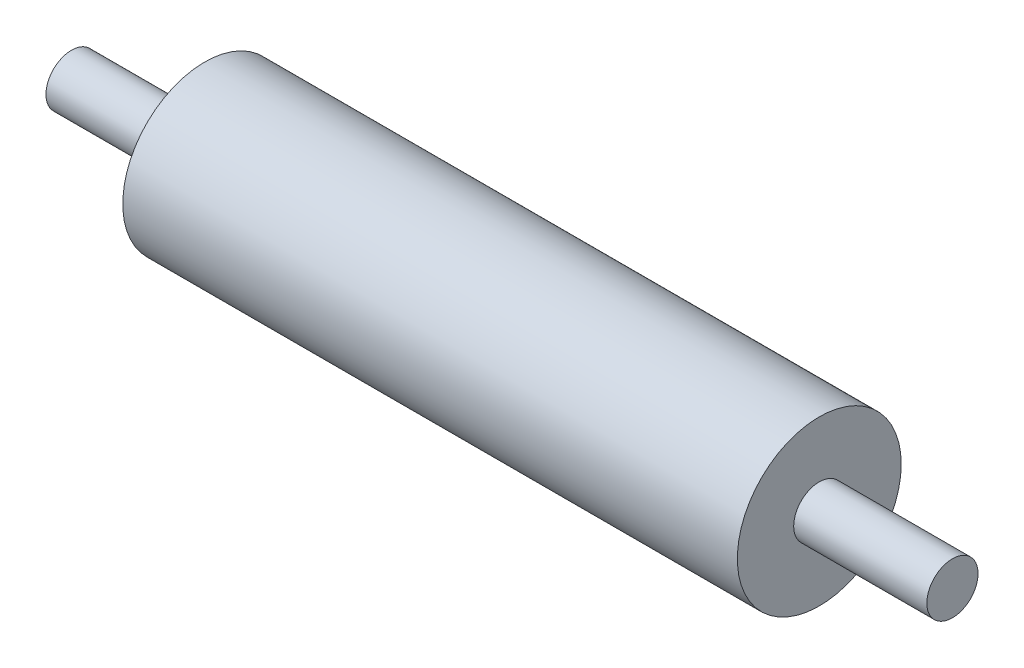
ISO-10303-21;
HEADER;
FILE_DESCRIPTION(('STEP AP214'),'2;1');
FILE_NAME('part.step','',(''),(''),'','','');
FILE_SCHEMA(('AUTOMOTIVE_DESIGN { 1 0 10303 214 1 1 1 1 }'));
ENDSEC;
DATA;
#1=APPLICATION_CONTEXT('core data for automotive mechanical design processes');
#2=APPLICATION_PROTOCOL_DEFINITION('international standard','automotive_design',2000,#1);
#3=PRODUCT_CONTEXT('',#1,'mechanical');
#4=PRODUCT('Part','Part','',(#3));
#5=PRODUCT_RELATED_PRODUCT_CATEGORY('part','',(#4));
#6=PRODUCT_DEFINITION_FORMATION('','',#4);
#7=PRODUCT_DEFINITION_CONTEXT('part definition',#1,'design');
#8=PRODUCT_DEFINITION('design','',#6,#7);
#9=PRODUCT_DEFINITION_SHAPE('','',#8);
#10=(LENGTH_UNIT() NAMED_UNIT(*) SI_UNIT(.MILLI.,.METRE.));
#11=(NAMED_UNIT(*) PLANE_ANGLE_UNIT() SI_UNIT($,.RADIAN.));
#12=(NAMED_UNIT(*) SI_UNIT($,.STERADIAN.) SOLID_ANGLE_UNIT());
#13=UNCERTAINTY_MEASURE_WITH_UNIT(LENGTH_MEASURE(1.E-05),#10,'distance_accuracy_value','');
#14=(GEOMETRIC_REPRESENTATION_CONTEXT(3) GLOBAL_UNCERTAINTY_ASSIGNED_CONTEXT((#13)) GLOBAL_UNIT_ASSIGNED_CONTEXT((#10,
#11,#12)) REPRESENTATION_CONTEXT('',''));
#15=CARTESIAN_POINT('',(0.,0.,0.));
#16=DIRECTION('',(0.,0.,1.));
#17=DIRECTION('',(1.,0.,0.));
#18=AXIS2_PLACEMENT_3D('',#15,#16,#17);
#19=CARTESIAN_POINT('',(30.,0.,0.));
#20=DIRECTION('',(1.,0.,0.));
#21=DIRECTION('',(0.,0.,-1.));
#22=AXIS2_PLACEMENT_3D('',#19,#20,#21);
#23=PLANE('',#22);
#24=CARTESIAN_POINT('',(30.,0.,0.));
#25=DIRECTION('',(1.,0.,0.));
#26=DIRECTION('',(0.,0.,-1.));
#27=AXIS2_PLACEMENT_3D('',#24,#25,#26);
#28=CIRCLE('',#27,8.);
#29=CARTESIAN_POINT('',(30.,0.,-8.));
#30=VERTEX_POINT('',#29);
#31=EDGE_CURVE('E36',#30,#30,#28,.T.);
#32=ORIENTED_EDGE('',*,*,#31,.T.);
#33=EDGE_LOOP('',(#32));
#34=FACE_BOUND('',#33,.T.);
#35=CARTESIAN_POINT('',(30.,0.,0.));
#36=DIRECTION('',(1.,0.,0.));
#37=DIRECTION('',(0.,0.,-1.));
#38=AXIS2_PLACEMENT_3D('',#35,#36,#37);
#39=CIRCLE('',#38,2.5);
#40=CARTESIAN_POINT('',(30.,0.,2.5));
#41=VERTEX_POINT('',#40);
#42=EDGE_CURVE('E44',#41,#41,#39,.T.);
#43=ORIENTED_EDGE('',*,*,#42,.F.);
#44=EDGE_LOOP('',(#43));
#45=FACE_BOUND('',#44,.T.);
#46=ADVANCED_FACE('F29',(#34,#45),#23,.T.);
#47=CARTESIAN_POINT('',(30.,0.,0.));
#48=DIRECTION('',(-1.,0.,0.));
#49=DIRECTION('',(0.,0.,1.));
#50=AXIS2_PLACEMENT_3D('',#47,#48,#49);
#51=CYLINDRICAL_SURFACE('',#50,8.);
#52=ORIENTED_EDGE('',*,*,#31,.F.);
#53=EDGE_LOOP('',(#52));
#54=FACE_BOUND('',#53,.T.);
#55=CARTESIAN_POINT('',(-30.,0.,0.));
#56=DIRECTION('',(1.,0.,0.));
#57=DIRECTION('',(0.,0.,-1.));
#58=AXIS2_PLACEMENT_3D('',#55,#56,#57);
#59=CIRCLE('',#58,8.);
#60=CARTESIAN_POINT('',(-30.,0.,-8.));
#61=VERTEX_POINT('',#60);
#62=EDGE_CURVE('E48',#61,#61,#59,.T.);
#63=ORIENTED_EDGE('',*,*,#62,.T.);
#64=EDGE_LOOP('',(#63));
#65=FACE_BOUND('',#64,.T.);
#66=ADVANCED_FACE('F31',(#54,#65),#51,.T.);
#67=CARTESIAN_POINT('',(43.,0.,0.));
#68=DIRECTION('',(-1.,0.,0.));
#69=DIRECTION('',(0.,0.,1.));
#70=AXIS2_PLACEMENT_3D('',#67,#68,#69);
#71=CYLINDRICAL_SURFACE('',#70,2.5);
#72=CARTESIAN_POINT('',(43.,0.,0.));
#73=DIRECTION('',(1.,0.,0.));
#74=DIRECTION('',(0.,0.,-1.));
#75=AXIS2_PLACEMENT_3D('',#72,#73,#74);
#76=CIRCLE('',#75,2.5);
#77=CARTESIAN_POINT('',(43.,0.,2.5));
#78=VERTEX_POINT('',#77);
#79=EDGE_CURVE('E40',#78,#78,#76,.T.);
#80=CARTESIAN_POINT('',(43.,0.,2.5));
#81=CARTESIAN_POINT('',(42.8645833333333,0.,2.5));
#82=CARTESIAN_POINT('',(42.7291666666667,0.,2.5));
#83=CARTESIAN_POINT('',(42.4583333333333,0.,2.5));
#84=CARTESIAN_POINT('',(42.3229166666667,0.,2.5));
#85=CARTESIAN_POINT('',(42.0520833333333,0.,2.5));
#86=CARTESIAN_POINT('',(41.9166666666667,0.,2.5));
#87=CARTESIAN_POINT('',(41.6458333333333,0.,2.5));
#88=CARTESIAN_POINT('',(41.5104166666667,0.,2.5));
#89=CARTESIAN_POINT('',(41.2395833333333,0.,2.5));
#90=CARTESIAN_POINT('',(41.1041666666667,0.,2.5));
#91=CARTESIAN_POINT('',(40.8333333333333,0.,2.5));
#92=CARTESIAN_POINT('',(40.6979166666667,0.,2.5));
#93=CARTESIAN_POINT('',(40.4270833333333,0.,2.5));
#94=CARTESIAN_POINT('',(40.2916666666667,0.,2.5));
#95=CARTESIAN_POINT('',(40.0208333333333,0.,2.5));
#96=CARTESIAN_POINT('',(39.8854166666667,0.,2.5));
#97=CARTESIAN_POINT('',(39.6145833333333,0.,2.5));
#98=CARTESIAN_POINT('',(39.4791666666667,0.,2.5));
#99=CARTESIAN_POINT('',(39.2083333333333,0.,2.5));
#100=CARTESIAN_POINT('',(39.0729166666667,0.,2.5));
#101=CARTESIAN_POINT('',(38.8020833333333,0.,2.5));
#102=CARTESIAN_POINT('',(38.6666666666667,0.,2.5));
#103=CARTESIAN_POINT('',(38.3958333333333,0.,2.5));
#104=CARTESIAN_POINT('',(38.2604166666667,0.,2.5));
#105=CARTESIAN_POINT('',(37.9895833333333,0.,2.5));
#106=CARTESIAN_POINT('',(37.8541666666667,0.,2.5));
#107=CARTESIAN_POINT('',(37.5833333333333,0.,2.5));
#108=CARTESIAN_POINT('',(37.4479166666667,0.,2.5));
#109=CARTESIAN_POINT('',(37.1770833333333,0.,2.5));
#110=CARTESIAN_POINT('',(37.0416666666667,0.,2.5));
#111=CARTESIAN_POINT('',(36.7708333333333,0.,2.5));
#112=CARTESIAN_POINT('',(36.6354166666667,0.,2.5));
#113=CARTESIAN_POINT('',(36.3645833333333,0.,2.5));
#114=CARTESIAN_POINT('',(36.2291666666667,0.,2.5));
#115=CARTESIAN_POINT('',(35.9583333333333,0.,2.5));
#116=CARTESIAN_POINT('',(35.8229166666667,0.,2.5));
#117=CARTESIAN_POINT('',(35.5520833333333,0.,2.5));
#118=CARTESIAN_POINT('',(35.4166666666667,0.,2.5));
#119=CARTESIAN_POINT('',(35.1458333333333,0.,2.5));
#120=CARTESIAN_POINT('',(35.0104166666667,0.,2.5));
#121=CARTESIAN_POINT('',(34.7395833333333,0.,2.5));
#122=CARTESIAN_POINT('',(34.6041666666667,0.,2.5));
#123=CARTESIAN_POINT('',(34.3333333333333,0.,2.5));
#124=CARTESIAN_POINT('',(34.1979166666667,0.,2.5));
#125=CARTESIAN_POINT('',(33.9270833333333,0.,2.5));
#126=CARTESIAN_POINT('',(33.7916666666667,0.,2.5));
#127=CARTESIAN_POINT('',(33.5208333333333,0.,2.5));
#128=CARTESIAN_POINT('',(33.3854166666667,0.,2.5));
#129=CARTESIAN_POINT('',(33.1145833333333,0.,2.5));
#130=CARTESIAN_POINT('',(32.9791666666667,0.,2.5));
#131=CARTESIAN_POINT('',(32.7083333333333,0.,2.5));
#132=CARTESIAN_POINT('',(32.5729166666667,0.,2.5));
#133=CARTESIAN_POINT('',(32.3020833333333,0.,2.5));
#134=CARTESIAN_POINT('',(32.1666666666667,0.,2.5));
#135=CARTESIAN_POINT('',(31.8958333333333,0.,2.5));
#136=CARTESIAN_POINT('',(31.7604166666667,0.,2.5));
#137=CARTESIAN_POINT('',(31.4895833333333,0.,2.5));
#138=CARTESIAN_POINT('',(31.3541666666667,0.,2.5));
#139=CARTESIAN_POINT('',(31.0833333333333,0.,2.5));
#140=CARTESIAN_POINT('',(30.9479166666667,0.,2.5));
#141=CARTESIAN_POINT('',(30.6770833333333,0.,2.5));
#142=CARTESIAN_POINT('',(30.5416666666667,0.,2.5));
#143=CARTESIAN_POINT('',(30.2708333333333,0.,2.5));
#144=CARTESIAN_POINT('',(30.1354166666667,0.,2.5));
#145=CARTESIAN_POINT('',(30.,0.,2.5));
#146=B_SPLINE_CURVE_WITH_KNOTS('',3,(#80,#81,#82,#83,#84,#85,#86,#87,#88,#89,#90,#91,#92,#93,
#94,#95,#96,#97,#98,#99,#100,#101,#102,#103,#104,#105,#106,#107,#108,#109,#110,#111,#112,#113,
#114,#115,#116,#117,#118,#119,#120,#121,#122,#123,#124,#125,#126,#127,#128,#129,#130,#131,#132,
#133,#134,#135,#136,#137,#138,#139,#140,#141,#142,#143,#144,#145),.UNSPECIFIED.,.F.,.F.,(4,2,2,
2,2,2,2,2,2,2,2,2,2,2,2,2,2,2,2,2,2,2,2,2,2,2,2,2,2,2,2,2,4),(0.,0.406249999999997,
0.812499999999994,1.21875,1.62499999999999,2.03125,2.4375,2.84375,3.25,3.65624999999999,4.0625,
4.46874999999999,4.875,5.28124999999999,5.68749999999999,6.09374999999999,6.49999999999999,
6.90625,7.31249999999999,7.71875,8.12499999999999,8.53125,8.93749999999999,9.34374999999999,
9.74999999999999,10.15625,10.5625,10.96875,11.375,11.78125,12.1875,12.59375,13.),.UNSPECIFIED.);
#147=EDGE_CURVE('BSEAM70',#78,#41,#146,.T.);
#148=ORIENTED_EDGE('',*,*,#79,.F.);
#149=ORIENTED_EDGE('',*,*,#42,.T.);
#150=ORIENTED_EDGE('',*,*,#147,.T.);
#151=ORIENTED_EDGE('',*,*,#147,.F.);
#152=EDGE_LOOP('',(#148,#150,#149,#151));
#153=FACE_BOUND('',#152,.T.);
#154=ADVANCED_FACE('F70',(#153),#71,.T.);
#155=CARTESIAN_POINT('',(43.,0.,0.));
#156=DIRECTION('',(1.,0.,0.));
#157=DIRECTION('',(0.,0.,-1.));
#158=AXIS2_PLACEMENT_3D('',#155,#156,#157);
#159=PLANE('',#158);
#160=ORIENTED_EDGE('',*,*,#79,.T.);
#161=EDGE_LOOP('',(#160));
#162=FACE_BOUND('',#161,.T.);
#163=ADVANCED_FACE('F76',(#162),#159,.T.);
#164=CARTESIAN_POINT('',(-30.,0.,0.));
#165=DIRECTION('',(-1.,0.,0.));
#166=DIRECTION('',(0.,0.,-1.));
#167=AXIS2_PLACEMENT_3D('',#164,#165,#166);
#168=PLANE('',#167);
#169=CARTESIAN_POINT('',(-30.,0.,0.));
#170=DIRECTION('',(-1.,0.,0.));
#171=DIRECTION('',(0.,0.,1.));
#172=AXIS2_PLACEMENT_3D('',#169,#170,#171);
#173=CIRCLE('',#172,2.5);
#174=CARTESIAN_POINT('',(-30.,0.,-2.5));
#175=VERTEX_POINT('',#174);
#176=EDGE_CURVE('E10',#175,#175,#173,.T.);
#177=ORIENTED_EDGE('',*,*,#176,.F.);
#178=EDGE_LOOP('',(#177));
#179=FACE_BOUND('',#178,.T.);
#180=ORIENTED_EDGE('',*,*,#62,.F.);
#181=EDGE_LOOP('',(#180));
#182=FACE_BOUND('',#181,.T.);
#183=ADVANCED_FACE('F64',(#179,#182),#168,.T.);
#184=CARTESIAN_POINT('',(-43.,0.,0.));
#185=DIRECTION('',(1.,0.,0.));
#186=DIRECTION('',(0.,0.,-1.));
#187=AXIS2_PLACEMENT_3D('',#184,#185,#186);
#188=CYLINDRICAL_SURFACE('',#187,2.5);
#189=CARTESIAN_POINT('',(-43.,0.,0.));
#190=DIRECTION('',(1.,0.,0.));
#191=DIRECTION('',(0.,0.,-1.));
#192=AXIS2_PLACEMENT_3D('',#189,#190,#191);
#193=CIRCLE('',#192,2.5);
#194=CARTESIAN_POINT('',(-43.,0.,-2.5));
#195=VERTEX_POINT('',#194);
#196=EDGE_CURVE('E52',#195,#195,#193,.T.);
#197=CARTESIAN_POINT('',(-43.,0.,-2.5));
#198=CARTESIAN_POINT('',(-42.8645833333333,0.,-2.5));
#199=CARTESIAN_POINT('',(-42.7291666666667,0.,-2.5));
#200=CARTESIAN_POINT('',(-42.4583333333333,0.,-2.5));
#201=CARTESIAN_POINT('',(-42.3229166666667,0.,-2.5));
#202=CARTESIAN_POINT('',(-42.0520833333333,0.,-2.5));
#203=CARTESIAN_POINT('',(-41.9166666666667,0.,-2.5));
#204=CARTESIAN_POINT('',(-41.6458333333333,0.,-2.5));
#205=CARTESIAN_POINT('',(-41.5104166666667,0.,-2.5));
#206=CARTESIAN_POINT('',(-41.2395833333333,0.,-2.5));
#207=CARTESIAN_POINT('',(-41.1041666666667,0.,-2.5));
#208=CARTESIAN_POINT('',(-40.8333333333333,0.,-2.5));
#209=CARTESIAN_POINT('',(-40.6979166666667,0.,-2.5));
#210=CARTESIAN_POINT('',(-40.4270833333333,0.,-2.5));
#211=CARTESIAN_POINT('',(-40.2916666666667,0.,-2.5));
#212=CARTESIAN_POINT('',(-40.0208333333333,0.,-2.5));
#213=CARTESIAN_POINT('',(-39.8854166666667,0.,-2.5));
#214=CARTESIAN_POINT('',(-39.6145833333333,0.,-2.5));
#215=CARTESIAN_POINT('',(-39.4791666666667,0.,-2.5));
#216=CARTESIAN_POINT('',(-39.2083333333333,0.,-2.5));
#217=CARTESIAN_POINT('',(-39.0729166666667,0.,-2.5));
#218=CARTESIAN_POINT('',(-38.8020833333333,0.,-2.5));
#219=CARTESIAN_POINT('',(-38.6666666666667,0.,-2.5));
#220=CARTESIAN_POINT('',(-38.3958333333333,0.,-2.5));
#221=CARTESIAN_POINT('',(-38.2604166666667,0.,-2.5));
#222=CARTESIAN_POINT('',(-37.9895833333333,0.,-2.5));
#223=CARTESIAN_POINT('',(-37.8541666666667,0.,-2.5));
#224=CARTESIAN_POINT('',(-37.5833333333333,0.,-2.5));
#225=CARTESIAN_POINT('',(-37.4479166666667,0.,-2.5));
#226=CARTESIAN_POINT('',(-37.1770833333333,0.,-2.5));
#227=CARTESIAN_POINT('',(-37.0416666666667,0.,-2.5));
#228=CARTESIAN_POINT('',(-36.7708333333333,0.,-2.5));
#229=CARTESIAN_POINT('',(-36.6354166666667,0.,-2.5));
#230=CARTESIAN_POINT('',(-36.3645833333333,0.,-2.5));
#231=CARTESIAN_POINT('',(-36.2291666666667,0.,-2.5));
#232=CARTESIAN_POINT('',(-35.9583333333333,0.,-2.5));
#233=CARTESIAN_POINT('',(-35.8229166666667,0.,-2.5));
#234=CARTESIAN_POINT('',(-35.5520833333333,0.,-2.5));
#235=CARTESIAN_POINT('',(-35.4166666666667,0.,-2.5));
#236=CARTESIAN_POINT('',(-35.1458333333333,0.,-2.5));
#237=CARTESIAN_POINT('',(-35.0104166666667,0.,-2.5));
#238=CARTESIAN_POINT('',(-34.7395833333333,0.,-2.5));
#239=CARTESIAN_POINT('',(-34.6041666666667,0.,-2.5));
#240=CARTESIAN_POINT('',(-34.3333333333333,0.,-2.5));
#241=CARTESIAN_POINT('',(-34.1979166666667,0.,-2.5));
#242=CARTESIAN_POINT('',(-33.9270833333333,0.,-2.5));
#243=CARTESIAN_POINT('',(-33.7916666666667,0.,-2.5));
#244=CARTESIAN_POINT('',(-33.5208333333333,0.,-2.5));
#245=CARTESIAN_POINT('',(-33.3854166666667,0.,-2.5));
#246=CARTESIAN_POINT('',(-33.1145833333333,0.,-2.5));
#247=CARTESIAN_POINT('',(-32.9791666666667,0.,-2.5));
#248=CARTESIAN_POINT('',(-32.7083333333333,0.,-2.5));
#249=CARTESIAN_POINT('',(-32.5729166666667,0.,-2.5));
#250=CARTESIAN_POINT('',(-32.3020833333333,0.,-2.5));
#251=CARTESIAN_POINT('',(-32.1666666666667,0.,-2.5));
#252=CARTESIAN_POINT('',(-31.8958333333333,0.,-2.5));
#253=CARTESIAN_POINT('',(-31.7604166666667,0.,-2.5));
#254=CARTESIAN_POINT('',(-31.4895833333333,0.,-2.5));
#255=CARTESIAN_POINT('',(-31.3541666666667,0.,-2.5));
#256=CARTESIAN_POINT('',(-31.0833333333333,0.,-2.5));
#257=CARTESIAN_POINT('',(-30.9479166666667,0.,-2.5));
#258=CARTESIAN_POINT('',(-30.6770833333333,0.,-2.5));
#259=CARTESIAN_POINT('',(-30.5416666666667,0.,-2.5));
#260=CARTESIAN_POINT('',(-30.2708333333333,0.,-2.5));
#261=CARTESIAN_POINT('',(-30.1354166666667,0.,-2.5));
#262=CARTESIAN_POINT('',(-30.,0.,-2.5));
#263=B_SPLINE_CURVE_WITH_KNOTS('',3,(#197,#198,#199,#200,#201,#202,#203,#204,#205,#206,#207,
#208,#209,#210,#211,#212,#213,#214,#215,#216,#217,#218,#219,#220,#221,#222,#223,#224,#225,#226,
#227,#228,#229,#230,#231,#232,#233,#234,#235,#236,#237,#238,#239,#240,#241,#242,#243,#244,#245,
#246,#247,#248,#249,#250,#251,#252,#253,#254,#255,#256,#257,#258,#259,#260,#261,#262),
.UNSPECIFIED.,.F.,.F.,(4,2,2,2,2,2,2,2,2,2,2,2,2,2,2,2,2,2,2,2,2,2,2,2,2,2,2,2,2,2,2,2,4),(0.,
0.406249999999997,0.812499999999994,1.21875,1.62499999999999,2.03125,2.4375,2.84375,3.25,
3.65625,4.0625,4.46874999999999,4.875,5.28125,5.6875,6.09374999999999,6.5,6.90625,7.3125,
7.71875,8.125,8.53125,8.9375,9.34375,9.74999999999999,10.15625,10.5625,10.96875,11.375,11.78125,
12.1875,12.59375,13.),.UNSPECIFIED.);
#264=EDGE_CURVE('BSEAM56',#195,#175,#263,.T.);
#265=ORIENTED_EDGE('',*,*,#196,.T.);
#266=ORIENTED_EDGE('',*,*,#176,.T.);
#267=ORIENTED_EDGE('',*,*,#264,.T.);
#268=ORIENTED_EDGE('',*,*,#264,.F.);
#269=EDGE_LOOP('',(#265,#267,#266,#268));
#270=FACE_BOUND('',#269,.T.);
#271=ADVANCED_FACE('F56',(#270),#188,.T.);
#272=CARTESIAN_POINT('',(-43.,0.,0.));
#273=DIRECTION('',(-1.,0.,0.));
#274=DIRECTION('',(0.,0.,-1.));
#275=AXIS2_PLACEMENT_3D('',#272,#273,#274);
#276=PLANE('',#275);
#277=ORIENTED_EDGE('',*,*,#196,.F.);
#278=EDGE_LOOP('',(#277));
#279=FACE_BOUND('',#278,.T.);
#280=ADVANCED_FACE('F58',(#279),#276,.T.);
#281=CLOSED_SHELL('',(#46,#66,#154,#163,#183,#271,#280));
#282=MANIFOLD_SOLID_BREP('B2',#281);
#283=ADVANCED_BREP_SHAPE_REPRESENTATION('',(#18,#282),#14);
#284=SHAPE_DEFINITION_REPRESENTATION(#9,#283);
ENDSEC;
END-ISO-10303-21;
